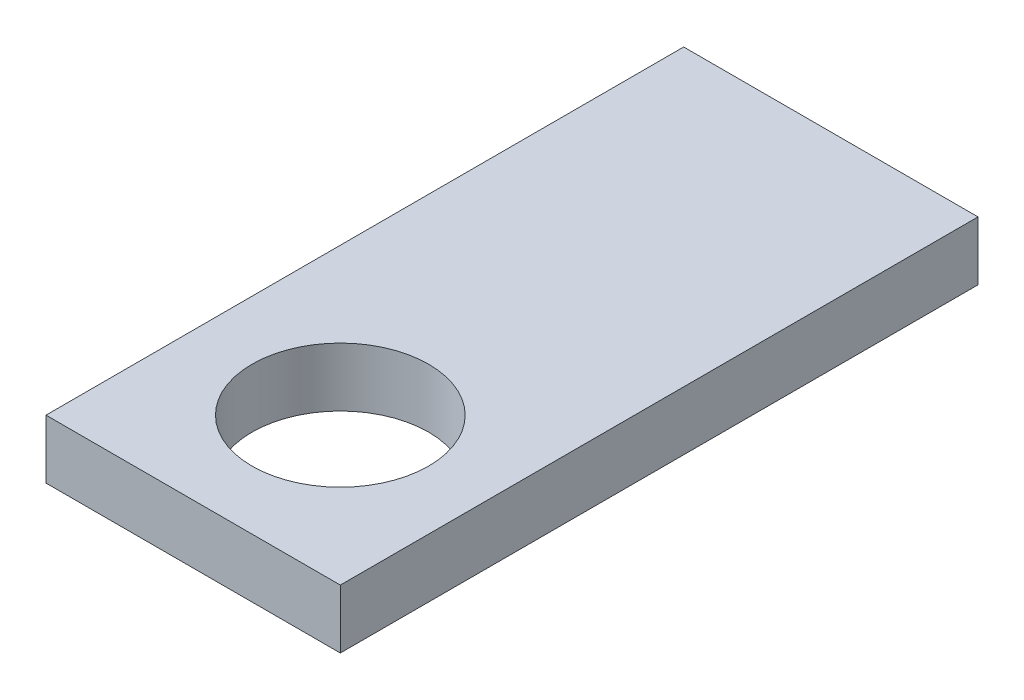
ISO-10303-21;
HEADER;
FILE_DESCRIPTION(('STEP AP214'),'2;1');
FILE_NAME('part.step','',(''),(''),'','','');
FILE_SCHEMA(('AUTOMOTIVE_DESIGN { 1 0 10303 214 1 1 1 1 }'));
ENDSEC;
DATA;
#1=APPLICATION_CONTEXT('core data for automotive mechanical design processes');
#2=APPLICATION_PROTOCOL_DEFINITION('international standard','automotive_design',2000,#1);
#3=PRODUCT_CONTEXT('',#1,'mechanical');
#4=PRODUCT('Part','Part','',(#3));
#5=PRODUCT_RELATED_PRODUCT_CATEGORY('part','',(#4));
#6=PRODUCT_DEFINITION_FORMATION('','',#4);
#7=PRODUCT_DEFINITION_CONTEXT('part definition',#1,'design');
#8=PRODUCT_DEFINITION('design','',#6,#7);
#9=PRODUCT_DEFINITION_SHAPE('','',#8);
#10=(LENGTH_UNIT() NAMED_UNIT(*) SI_UNIT(.MILLI.,.METRE.));
#11=(NAMED_UNIT(*) PLANE_ANGLE_UNIT() SI_UNIT($,.RADIAN.));
#12=(NAMED_UNIT(*) SI_UNIT($,.STERADIAN.) SOLID_ANGLE_UNIT());
#13=UNCERTAINTY_MEASURE_WITH_UNIT(LENGTH_MEASURE(1.E-05),#10,'distance_accuracy_value','');
#14=(GEOMETRIC_REPRESENTATION_CONTEXT(3) GLOBAL_UNCERTAINTY_ASSIGNED_CONTEXT((#13)) GLOBAL_UNIT_ASSIGNED_CONTEXT((#10,
#11,#12)) REPRESENTATION_CONTEXT('',''));
#15=CARTESIAN_POINT('',(0.,0.,0.));
#16=DIRECTION('',(0.,0.,1.));
#17=DIRECTION('',(1.,0.,0.));
#18=AXIS2_PLACEMENT_3D('',#15,#16,#17);
#19=CARTESIAN_POINT('',(0.,3.,7.5));
#20=DIRECTION('',(0.,0.,-1.));
#21=DIRECTION('',(-1.,0.,0.));
#22=AXIS2_PLACEMENT_3D('',#19,#20,#21);
#23=PLANE('',#22);
#24=DIRECTION('',(1.,0.,0.));
#25=VECTOR('',#24,1.);
#26=CARTESIAN_POINT('',(0.,0.,7.5));
#27=LINE('',#26,#25);
#28=CARTESIAN_POINT('',(-7.5,0.,7.5));
#29=VERTEX_POINT('',#28);
#30=CARTESIAN_POINT('',(7.5,0.,7.5));
#31=VERTEX_POINT('',#30);
#32=EDGE_CURVE('E118',#29,#31,#27,.T.);
#33=ORIENTED_EDGE('',*,*,#32,.T.);
#34=DIRECTION('',(0.,-1.,0.));
#35=VECTOR('',#34,1.);
#36=CARTESIAN_POINT('',(7.5,3.,7.5));
#37=LINE('',#36,#35);
#38=CARTESIAN_POINT('',(7.5,3.,7.5));
#39=VERTEX_POINT('',#38);
#40=EDGE_CURVE('E11',#39,#31,#37,.T.);
#41=ORIENTED_EDGE('',*,*,#40,.F.);
#42=DIRECTION('',(1.,0.,0.));
#43=VECTOR('',#42,1.);
#44=CARTESIAN_POINT('',(0.,3.,7.5));
#45=LINE('',#44,#43);
#46=CARTESIAN_POINT('',(-7.5,3.,7.5));
#47=VERTEX_POINT('',#46);
#48=EDGE_CURVE('E96',#47,#39,#45,.T.);
#49=ORIENTED_EDGE('',*,*,#48,.F.);
#50=DIRECTION('',(0.,-1.,0.));
#51=VECTOR('',#50,1.);
#52=CARTESIAN_POINT('',(-7.5,3.,7.5));
#53=LINE('',#52,#51);
#54=EDGE_CURVE('E62',#47,#29,#53,.T.);
#55=ORIENTED_EDGE('',*,*,#54,.T.);
#56=EDGE_LOOP('',(#33,#41,#49,#55));
#57=FACE_BOUND('',#56,.T.);
#58=ADVANCED_FACE('F45',(#57),#23,.F.);
#59=CARTESIAN_POINT('',(7.5,3.,0.));
#60=DIRECTION('',(-1.,0.,0.));
#61=DIRECTION('',(0.,0.,1.));
#62=AXIS2_PLACEMENT_3D('',#59,#60,#61);
#63=PLANE('',#62);
#64=DIRECTION('',(0.,0.,-1.));
#65=VECTOR('',#64,1.);
#66=CARTESIAN_POINT('',(7.5,0.,0.));
#67=LINE('',#66,#65);
#68=CARTESIAN_POINT('',(7.5,0.,-25.));
#69=VERTEX_POINT('',#68);
#70=EDGE_CURVE('E102',#31,#69,#67,.T.);
#71=ORIENTED_EDGE('',*,*,#70,.T.);
#72=DIRECTION('',(0.,-1.,0.));
#73=VECTOR('',#72,1.);
#74=CARTESIAN_POINT('',(7.5,3.,-25.));
#75=LINE('',#74,#73);
#76=CARTESIAN_POINT('',(7.5,3.,-25.));
#77=VERTEX_POINT('',#76);
#78=EDGE_CURVE('E54',#77,#69,#75,.T.);
#79=ORIENTED_EDGE('',*,*,#78,.F.);
#80=DIRECTION('',(0.,0.,-1.));
#81=VECTOR('',#80,1.);
#82=CARTESIAN_POINT('',(7.5,3.,0.));
#83=LINE('',#82,#81);
#84=EDGE_CURVE('E87',#39,#77,#83,.T.);
#85=ORIENTED_EDGE('',*,*,#84,.F.);
#86=ORIENTED_EDGE('',*,*,#40,.T.);
#87=EDGE_LOOP('',(#71,#79,#85,#86));
#88=FACE_BOUND('',#87,.T.);
#89=ADVANCED_FACE('F101',(#88),#63,.F.);
#90=CARTESIAN_POINT('',(0.,3.,-25.));
#91=DIRECTION('',(0.,0.,-1.));
#92=DIRECTION('',(-1.,0.,0.));
#93=AXIS2_PLACEMENT_3D('',#90,#91,#92);
#94=PLANE('',#93);
#95=DIRECTION('',(1.,0.,0.));
#96=VECTOR('',#95,1.);
#97=CARTESIAN_POINT('',(0.,0.,-25.));
#98=LINE('',#97,#96);
#99=CARTESIAN_POINT('',(-7.5,0.,-25.));
#100=VERTEX_POINT('',#99);
#101=EDGE_CURVE('E123',#100,#69,#98,.T.);
#102=ORIENTED_EDGE('',*,*,#101,.F.);
#103=DIRECTION('',(0.,-1.,0.));
#104=VECTOR('',#103,1.);
#105=CARTESIAN_POINT('',(-7.5,3.,-25.));
#106=LINE('',#105,#104);
#107=CARTESIAN_POINT('',(-7.5,3.,-25.));
#108=VERTEX_POINT('',#107);
#109=EDGE_CURVE('E76',#108,#100,#106,.T.);
#110=ORIENTED_EDGE('',*,*,#109,.F.);
#111=DIRECTION('',(1.,0.,0.));
#112=VECTOR('',#111,1.);
#113=CARTESIAN_POINT('',(0.,3.,-25.));
#114=LINE('',#113,#112);
#115=EDGE_CURVE('E95',#108,#77,#114,.T.);
#116=ORIENTED_EDGE('',*,*,#115,.T.);
#117=ORIENTED_EDGE('',*,*,#78,.T.);
#118=EDGE_LOOP('',(#102,#110,#116,#117));
#119=FACE_BOUND('',#118,.T.);
#120=ADVANCED_FACE('F106',(#119),#94,.T.);
#121=CARTESIAN_POINT('',(-7.5,3.,0.));
#122=DIRECTION('',(-1.,0.,0.));
#123=DIRECTION('',(0.,0.,1.));
#124=AXIS2_PLACEMENT_3D('',#121,#122,#123);
#125=PLANE('',#124);
#126=DIRECTION('',(0.,0.,-1.));
#127=VECTOR('',#126,1.);
#128=CARTESIAN_POINT('',(-7.5,0.,0.));
#129=LINE('',#128,#127);
#130=EDGE_CURVE('E126',#29,#100,#129,.T.);
#131=ORIENTED_EDGE('',*,*,#130,.F.);
#132=ORIENTED_EDGE('',*,*,#54,.F.);
#133=DIRECTION('',(0.,0.,-1.));
#134=VECTOR('',#133,1.);
#135=CARTESIAN_POINT('',(-7.5,3.,0.));
#136=LINE('',#135,#134);
#137=EDGE_CURVE('E108',#47,#108,#136,.T.);
#138=ORIENTED_EDGE('',*,*,#137,.T.);
#139=ORIENTED_EDGE('',*,*,#109,.T.);
#140=EDGE_LOOP('',(#131,#132,#138,#139));
#141=FACE_BOUND('',#140,.T.);
#142=ADVANCED_FACE('F144',(#141),#125,.T.);
#143=CARTESIAN_POINT('',(0.,3.,0.));
#144=DIRECTION('',(0.,-1.,0.));
#145=DIRECTION('',(0.,0.,-1.));
#146=AXIS2_PLACEMENT_3D('',#143,#144,#145);
#147=CYLINDRICAL_SURFACE('',#146,4.5);
#148=CARTESIAN_POINT('',(0.,3.,0.));
#149=DIRECTION('',(0.,1.,0.));
#150=DIRECTION('',(0.,0.,1.));
#151=AXIS2_PLACEMENT_3D('',#148,#149,#150);
#152=CIRCLE('',#151,4.5);
#153=CARTESIAN_POINT('',(0.,3.,4.5));
#154=VERTEX_POINT('',#153);
#155=EDGE_CURVE('E111',#154,#154,#152,.T.);
#156=ORIENTED_EDGE('',*,*,#155,.T.);
#157=EDGE_LOOP('',(#156));
#158=FACE_BOUND('',#157,.T.);
#159=CARTESIAN_POINT('',(0.,0.,0.));
#160=DIRECTION('',(0.,1.,0.));
#161=DIRECTION('',(0.,0.,1.));
#162=AXIS2_PLACEMENT_3D('',#159,#160,#161);
#163=CIRCLE('',#162,4.5);
#164=CARTESIAN_POINT('',(0.,0.,4.5));
#165=VERTEX_POINT('',#164);
#166=EDGE_CURVE('E130',#165,#165,#163,.T.);
#167=ORIENTED_EDGE('',*,*,#166,.F.);
#168=EDGE_LOOP('',(#167));
#169=FACE_BOUND('',#168,.T.);
#170=ADVANCED_FACE('F142',(#158,#169),#147,.F.);
#171=CARTESIAN_POINT('',(0.,3.,0.));
#172=DIRECTION('',(0.,1.,0.));
#173=DIRECTION('',(0.,0.,1.));
#174=AXIS2_PLACEMENT_3D('',#171,#172,#173);
#175=PLANE('',#174);
#176=ORIENTED_EDGE('',*,*,#48,.T.);
#177=ORIENTED_EDGE('',*,*,#84,.T.);
#178=ORIENTED_EDGE('',*,*,#115,.F.);
#179=ORIENTED_EDGE('',*,*,#137,.F.);
#180=EDGE_LOOP('',(#176,#177,#178,#179));
#181=FACE_BOUND('',#180,.T.);
#182=ORIENTED_EDGE('',*,*,#155,.F.);
#183=EDGE_LOOP('',(#182));
#184=FACE_BOUND('',#183,.T.);
#185=ADVANCED_FACE('F91',(#181,#184),#175,.T.);
#186=CARTESIAN_POINT('',(0.,0.,0.));
#187=DIRECTION('',(0.,1.,0.));
#188=DIRECTION('',(0.,0.,1.));
#189=AXIS2_PLACEMENT_3D('',#186,#187,#188);
#190=PLANE('',#189);
#191=ORIENTED_EDGE('',*,*,#32,.F.);
#192=ORIENTED_EDGE('',*,*,#130,.T.);
#193=ORIENTED_EDGE('',*,*,#101,.T.);
#194=ORIENTED_EDGE('',*,*,#70,.F.);
#195=EDGE_LOOP('',(#191,#192,#193,#194));
#196=FACE_BOUND('',#195,.T.);
#197=ORIENTED_EDGE('',*,*,#166,.T.);
#198=EDGE_LOOP('',(#197));
#199=FACE_BOUND('',#198,.T.);
#200=ADVANCED_FACE('F140',(#196,#199),#190,.F.);
#201=CLOSED_SHELL('',(#58,#89,#120,#142,#170,#185,#200));
#202=MANIFOLD_SOLID_BREP('B2',#201);
#203=ADVANCED_BREP_SHAPE_REPRESENTATION('',(#18,#202),#14);
#204=SHAPE_DEFINITION_REPRESENTATION(#9,#203);
ENDSEC;
END-ISO-10303-21;
